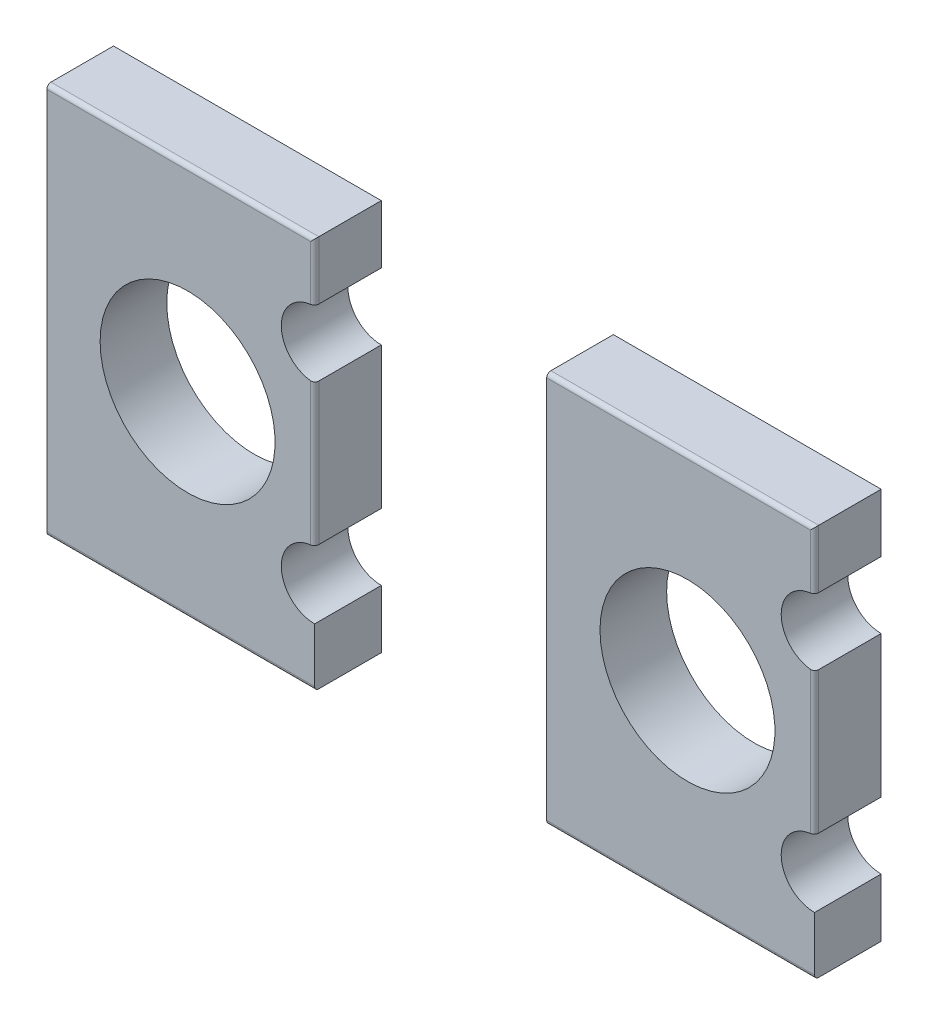
ISO-10303-21;
HEADER;
FILE_DESCRIPTION(('STEP AP214'),'2;1');
FILE_NAME('part.step','',(''),(''),'','','');
FILE_SCHEMA(('AUTOMOTIVE_DESIGN { 1 0 10303 214 1 1 1 1 }'));
ENDSEC;
DATA;
#1=APPLICATION_CONTEXT('core data for automotive mechanical design processes');
#2=APPLICATION_PROTOCOL_DEFINITION('international standard','automotive_design',2000,#1);
#3=PRODUCT_CONTEXT('',#1,'mechanical');
#4=PRODUCT('Part','Part','',(#3));
#5=PRODUCT_RELATED_PRODUCT_CATEGORY('part','',(#4));
#6=PRODUCT_DEFINITION_FORMATION('','',#4);
#7=PRODUCT_DEFINITION_CONTEXT('part definition',#1,'design');
#8=PRODUCT_DEFINITION('design','',#6,#7);
#9=PRODUCT_DEFINITION_SHAPE('','',#8);
#10=(LENGTH_UNIT() NAMED_UNIT(*) SI_UNIT(.MILLI.,.METRE.));
#11=(NAMED_UNIT(*) PLANE_ANGLE_UNIT() SI_UNIT($,.RADIAN.));
#12=(NAMED_UNIT(*) SI_UNIT($,.STERADIAN.) SOLID_ANGLE_UNIT());
#13=UNCERTAINTY_MEASURE_WITH_UNIT(LENGTH_MEASURE(1.E-05),#10,'distance_accuracy_value','');
#14=(GEOMETRIC_REPRESENTATION_CONTEXT(3) GLOBAL_UNCERTAINTY_ASSIGNED_CONTEXT((#13)) GLOBAL_UNIT_ASSIGNED_CONTEXT((#10,
#11,#12)) REPRESENTATION_CONTEXT('',''));
#15=CARTESIAN_POINT('',(0.,0.,0.));
#16=DIRECTION('',(0.,0.,1.));
#17=DIRECTION('',(1.,0.,0.));
#18=AXIS2_PLACEMENT_3D('',#15,#16,#17);
#19=CARTESIAN_POINT('',(78.,-23.5,-2.37395000000016));
#20=DIRECTION('',(1.,0.,0.));
#21=DIRECTION('',(0.,0.,1.));
#22=AXIS2_PLACEMENT_3D('',#19,#20,#21);
#23=PLANE('',#22);
#24=DIRECTION('',(0.,-1.,0.));
#25=VECTOR('',#24,1.);
#26=CARTESIAN_POINT('',(78.,-8.50000000000002,-2.87395000000006));
#27=LINE('',#26,#25);
#28=CARTESIAN_POINT('',(78.,23.5,-2.87394999999983));
#29=VERTEX_POINT('',#28);
#30=CARTESIAN_POINT('',(78.,16.5,-2.87394999999988));
#31=VERTEX_POINT('',#30);
#32=EDGE_CURVE('E191',#29,#31,#27,.T.);
#33=ORIENTED_EDGE('',*,*,#32,.T.);
#34=DIRECTION('',(0.,0.,1.));
#35=VECTOR('',#34,1.);
#36=CARTESIAN_POINT('',(78.,16.5,-10.3739499999999));
#37=LINE('',#36,#35);
#38=CARTESIAN_POINT('',(78.,16.5,-10.3739499999999));
#39=VERTEX_POINT('',#38);
#40=EDGE_CURVE('E62',#39,#31,#37,.T.);
#41=ORIENTED_EDGE('',*,*,#40,.F.);
#42=DIRECTION('',(0.,-1.,0.));
#43=VECTOR('',#42,1.);
#44=CARTESIAN_POINT('',(78.,-23.5,-10.3739500000002));
#45=LINE('',#44,#43);
#46=CARTESIAN_POINT('',(78.,23.5,-10.3739499999998));
#47=VERTEX_POINT('',#46);
#48=EDGE_CURVE('E148',#47,#39,#45,.T.);
#49=ORIENTED_EDGE('',*,*,#48,.F.);
#50=DIRECTION('',(0.,0.,-1.));
#51=VECTOR('',#50,1.);
#52=CARTESIAN_POINT('',(78.,23.5,-2.37394999999983));
#53=LINE('',#52,#51);
#54=EDGE_CURVE('E171',#29,#47,#53,.T.);
#55=ORIENTED_EDGE('',*,*,#54,.F.);
#56=EDGE_LOOP('',(#33,#41,#49,#55));
#57=FACE_BOUND('',#56,.T.);
#58=ADVANCED_FACE('F42',(#57),#23,.T.);
#59=CARTESIAN_POINT('',(78.,8.50000000000004,-10.3739499999999));
#60=VERTEX_POINT('',#59);
#61=CARTESIAN_POINT('',(78.,-8.49999999999996,-10.3739500000001));
#62=VERTEX_POINT('',#61);
#63=EDGE_CURVE('E144',#60,#62,#45,.T.);
#64=ORIENTED_EDGE('',*,*,#63,.F.);
#65=DIRECTION('',(0.,0.,1.));
#66=VECTOR('',#65,1.);
#67=CARTESIAN_POINT('',(78.,8.50000000000004,-10.3739499999999));
#68=LINE('',#67,#66);
#69=CARTESIAN_POINT('',(78.,8.49999999999999,-2.87394999999994));
#70=VERTEX_POINT('',#69);
#71=EDGE_CURVE('E132',#60,#70,#68,.T.);
#72=ORIENTED_EDGE('',*,*,#71,.T.);
#73=CARTESIAN_POINT('',(78.,-8.50000000000002,-2.87395000000006));
#74=VERTEX_POINT('',#73);
#75=EDGE_CURVE('E190',#70,#74,#27,.T.);
#76=ORIENTED_EDGE('',*,*,#75,.T.);
#77=DIRECTION('',(0.,0.,1.));
#78=VECTOR('',#77,1.);
#79=CARTESIAN_POINT('',(78.,-8.49999999999996,-10.3739500000001));
#80=LINE('',#79,#78);
#81=EDGE_CURVE('E154',#62,#74,#80,.T.);
#82=ORIENTED_EDGE('',*,*,#81,.F.);
#83=EDGE_LOOP('',(#64,#72,#76,#82));
#84=FACE_BOUND('',#83,.T.);
#85=ADVANCED_FACE('F152',(#84),#23,.T.);
#86=CARTESIAN_POINT('',(45.856,23.5,-2.37394999999983));
#87=DIRECTION('',(0.,0.,-1.));
#88=DIRECTION('',(1.,0.,0.));
#89=AXIS2_PLACEMENT_3D('',#86,#87,#88);
#90=PLANE('',#89);
#91=CARTESIAN_POINT('',(62.75,0.,-2.37395));
#92=DIRECTION('',(0.,0.,1.));
#93=DIRECTION('',(-1.,0.,0.));
#94=AXIS2_PLACEMENT_3D('',#91,#92,#93);
#95=CIRCLE('',#94,10.5);
#96=CARTESIAN_POINT('',(52.25,0.,-2.37395));
#97=VERTEX_POINT('',#96);
#98=EDGE_CURVE('E293',#97,#97,#95,.T.);
#99=ORIENTED_EDGE('',*,*,#98,.F.);
#100=EDGE_LOOP('',(#99));
#101=FACE_BOUND('',#100,.T.);
#102=CARTESIAN_POINT('',(78.,12.5,-2.37394999999991));
#103=DIRECTION('',(0.,0.,-1.));
#104=DIRECTION('',(-1.,0.,0.));
#105=AXIS2_PLACEMENT_3D('',#102,#103,#104);
#106=CIRCLE('',#105,4.);
#107=CARTESIAN_POINT('',(77.5,8.5313730334031,-2.37394999999994));
#108=VERTEX_POINT('',#107);
#109=CARTESIAN_POINT('',(77.5,16.4686269665969,-2.37394999999988));
#110=VERTEX_POINT('',#109);
#111=EDGE_CURVE('E149',#108,#110,#106,.T.);
#112=ORIENTED_EDGE('',*,*,#111,.T.);
#113=DIRECTION('',(0.,-1.,0.));
#114=VECTOR('',#113,1.);
#115=CARTESIAN_POINT('',(77.5,23.5,-2.37394999999983));
#116=LINE('',#115,#114);
#117=CARTESIAN_POINT('',(77.5,23.,-2.37394999999984));
#118=VERTEX_POINT('',#117);
#119=EDGE_CURVE('E180',#110,#118,#116,.F.);
#120=ORIENTED_EDGE('',*,*,#119,.T.);
#121=DIRECTION('',(1.,0.,0.));
#122=VECTOR('',#121,1.);
#123=CARTESIAN_POINT('',(45.856,23.,-2.37394999999984));
#124=LINE('',#123,#122);
#125=CARTESIAN_POINT('',(45.856,23.,-2.37394999999984));
#126=VERTEX_POINT('',#125);
#127=EDGE_CURVE('E184',#118,#126,#124,.F.);
#128=ORIENTED_EDGE('',*,*,#127,.T.);
#129=DIRECTION('',(0.,1.,0.));
#130=VECTOR('',#129,1.);
#131=CARTESIAN_POINT('',(45.856,-23.5,-2.37395000000016));
#132=LINE('',#131,#130);
#133=CARTESIAN_POINT('',(45.856,-23.,-2.37395000000016));
#134=VERTEX_POINT('',#133);
#135=EDGE_CURVE('E165',#134,#126,#132,.T.);
#136=ORIENTED_EDGE('',*,*,#135,.F.);
#137=DIRECTION('',(-1.,0.,0.));
#138=VECTOR('',#137,1.);
#139=CARTESIAN_POINT('',(78.,-23.,-2.37395000000016));
#140=LINE('',#139,#138);
#141=CARTESIAN_POINT('',(78.,-23.,-2.37395000000016));
#142=VERTEX_POINT('',#141);
#143=EDGE_CURVE('E178',#134,#142,#140,.F.);
#144=ORIENTED_EDGE('',*,*,#143,.T.);
#145=DIRECTION('',(0.,-1.,0.));
#146=VECTOR('',#145,1.);
#147=CARTESIAN_POINT('',(78.,-23.5,-2.37395000000016));
#148=LINE('',#147,#146);
#149=CARTESIAN_POINT('',(78.,-16.5,-2.37395000000011));
#150=VERTEX_POINT('',#149);
#151=EDGE_CURVE('E175',#150,#142,#148,.T.);
#152=ORIENTED_EDGE('',*,*,#151,.F.);
#153=CARTESIAN_POINT('',(78.,-12.5,-2.37395000000008));
#154=DIRECTION('',(0.,0.,1.));
#155=DIRECTION('',(-1.,0.,0.));
#156=AXIS2_PLACEMENT_3D('',#153,#154,#155);
#157=CIRCLE('',#156,4.);
#158=CARTESIAN_POINT('',(77.5,-8.53137303340313,-2.37395000000006));
#159=VERTEX_POINT('',#158);
#160=EDGE_CURVE('E261',#159,#150,#157,.T.);
#161=ORIENTED_EDGE('',*,*,#160,.F.);
#162=EDGE_CURVE('E181',#159,#108,#116,.F.);
#163=ORIENTED_EDGE('',*,*,#162,.T.);
#164=EDGE_LOOP('',(#112,#120,#128,#136,#144,#152,#161,#163));
#165=FACE_BOUND('',#164,.T.);
#166=ADVANCED_FACE('F218',(#101,#165),#90,.F.);
#167=CARTESIAN_POINT('',(45.856,23.5,-10.3739499999998));
#168=DIRECTION('',(0.,0.,-1.));
#169=DIRECTION('',(1.,0.,0.));
#170=AXIS2_PLACEMENT_3D('',#167,#168,#169);
#171=PLANE('',#170);
#172=CARTESIAN_POINT('',(62.75,0.,-10.37395));
#173=DIRECTION('',(0.,0.,1.));
#174=DIRECTION('',(-1.,0.,0.));
#175=AXIS2_PLACEMENT_3D('',#172,#173,#174);
#176=CIRCLE('',#175,10.5);
#177=CARTESIAN_POINT('',(52.25,0.,-10.37395));
#178=VERTEX_POINT('',#177);
#179=EDGE_CURVE('E279',#178,#178,#176,.T.);
#180=ORIENTED_EDGE('',*,*,#179,.T.);
#181=EDGE_LOOP('',(#180));
#182=FACE_BOUND('',#181,.T.);
#183=ORIENTED_EDGE('',*,*,#48,.T.);
#184=CARTESIAN_POINT('',(78.,12.5,-10.3739499999999));
#185=DIRECTION('',(0.,0.,-1.));
#186=DIRECTION('',(-1.,0.,0.));
#187=AXIS2_PLACEMENT_3D('',#184,#185,#186);
#188=CIRCLE('',#187,4.);
#189=EDGE_CURVE('E135',#60,#39,#188,.T.);
#190=ORIENTED_EDGE('',*,*,#189,.F.);
#191=ORIENTED_EDGE('',*,*,#63,.T.);
#192=CARTESIAN_POINT('',(78.,-12.5,-10.3739500000001));
#193=DIRECTION('',(0.,0.,1.));
#194=DIRECTION('',(-1.,0.,0.));
#195=AXIS2_PLACEMENT_3D('',#192,#193,#194);
#196=CIRCLE('',#195,4.);
#197=CARTESIAN_POINT('',(78.,-16.5,-10.3739500000001));
#198=VERTEX_POINT('',#197);
#199=EDGE_CURVE('E263',#62,#198,#196,.T.);
#200=ORIENTED_EDGE('',*,*,#199,.T.);
#201=CARTESIAN_POINT('',(78.,-23.5,-10.3739500000002));
#202=VERTEX_POINT('',#201);
#203=EDGE_CURVE('E155',#198,#202,#45,.T.);
#204=ORIENTED_EDGE('',*,*,#203,.T.);
#205=DIRECTION('',(-1.,0.,0.));
#206=VECTOR('',#205,1.);
#207=CARTESIAN_POINT('',(45.856,-23.5,-10.3739500000002));
#208=LINE('',#207,#206);
#209=CARTESIAN_POINT('',(45.856,-23.5,-10.3739500000002));
#210=VERTEX_POINT('',#209);
#211=EDGE_CURVE('E157',#202,#210,#208,.T.);
#212=ORIENTED_EDGE('',*,*,#211,.T.);
#213=DIRECTION('',(0.,1.,0.));
#214=VECTOR('',#213,1.);
#215=CARTESIAN_POINT('',(45.856,-23.5,-10.3739500000002));
#216=LINE('',#215,#214);
#217=CARTESIAN_POINT('',(45.856,23.5,-10.3739499999998));
#218=VERTEX_POINT('',#217);
#219=EDGE_CURVE('E278',#210,#218,#216,.T.);
#220=ORIENTED_EDGE('',*,*,#219,.T.);
#221=DIRECTION('',(1.,0.,0.));
#222=VECTOR('',#221,1.);
#223=CARTESIAN_POINT('',(45.856,23.5,-10.3739499999998));
#224=LINE('',#223,#222);
#225=EDGE_CURVE('E159',#218,#47,#224,.T.);
#226=ORIENTED_EDGE('',*,*,#225,.T.);
#227=EDGE_LOOP('',(#183,#190,#191,#200,#204,#212,#220,#226));
#228=FACE_BOUND('',#227,.T.);
#229=ADVANCED_FACE('F142',(#182,#228),#171,.T.);
#230=CARTESIAN_POINT('',(77.5,-23.5,-2.87395000000016));
#231=DIRECTION('',(0.,1.,0.));
#232=DIRECTION('',(0.,0.,1.));
#233=AXIS2_PLACEMENT_3D('',#230,#231,#232);
#234=CYLINDRICAL_SURFACE('',#233,0.5);
#235=ORIENTED_EDGE('',*,*,#75,.F.);
#236=CARTESIAN_POINT('',(78.,8.49999999999999,-2.87394999999994));
#237=CARTESIAN_POINT('',(78.0000238852926,8.50000844736236,-2.84582521756565));
#238=CARTESIAN_POINT('',(77.9976284168206,8.50000014137243,-2.81770752553701));
#239=CARTESIAN_POINT('',(77.9881748673677,8.50001245699837,-2.76228805177802));
#240=CARTESIAN_POINT('',(77.9811203171639,8.50003305672199,-2.73498566854843));
#241=CARTESIAN_POINT('',(77.9625196642059,8.50016547430944,-2.68194063548705));
#242=CARTESIAN_POINT('',(77.9509713668905,8.50027733677154,-2.65619875485057));
#243=CARTESIAN_POINT('',(77.923721664622,8.50070408728427,-2.60702392898067));
#244=CARTESIAN_POINT('',(77.9080209811445,8.50101894007906,-2.58359058360989));
#245=CARTESIAN_POINT('',(77.8729243728044,8.50198068078659,-2.53971006134666));
#246=CARTESIAN_POINT('',(77.8535309043002,8.50262734846531,-2.51926091531324));
#247=CARTESIAN_POINT('',(77.811597391798,8.5043844154786,-2.48190998407642));
#248=CARTESIAN_POINT('',(77.7890569391532,8.50549487507551,-2.46500866028465));
#249=CARTESIAN_POINT('',(77.7415512242527,8.50828754021241,-2.43527410270588));
#250=CARTESIAN_POINT('',(77.7165923122098,8.50996827594664,-2.422430573243));
#251=CARTESIAN_POINT('',(77.6649278832305,8.51397488277034,-2.40110892277394));
#252=CARTESIAN_POINT('',(77.6382232071983,8.51630044498261,-2.39262871723952));
#253=CARTESIAN_POINT('',(77.5928023270264,8.52073791090588,-2.38228082681515));
#254=CARTESIAN_POINT('',(77.5743444618312,8.52266893611079,-2.37915596094231));
#255=CARTESIAN_POINT('',(77.5372542496884,8.52681264427116,-2.37499068595531));
#256=CARTESIAN_POINT('',(77.5186222022104,8.52902490513208,-2.3739471913868));
#257=CARTESIAN_POINT('',(77.5,8.5313730334031,-2.37394999999994));
#258=B_SPLINE_CURVE_WITH_KNOTS('',3,(#236,#237,#238,#239,#240,#241,#242,#243,#244,#245,#246,
#247,#248,#249,#250,#251,#252,#253,#254,#255,#256,#257),.UNSPECIFIED.,.F.,.F.,(4,2,2,2,2,2,2,2,
2,2,4),(0.,0.0842623736269267,0.168460964127702,0.252700725462577,0.336925859772936,
0.421095163882221,0.505275407848148,0.589240316780146,0.673165075102063,0.729513611671212,
0.785778554103672),.UNSPECIFIED.);
#259=EDGE_CURVE('E12',#70,#108,#258,.T.);
#260=ORIENTED_EDGE('',*,*,#259,.T.);
#261=ORIENTED_EDGE('',*,*,#162,.F.);
#262=CARTESIAN_POINT('',(78.,-8.50000000000002,-2.87395000000006));
#263=CARTESIAN_POINT('',(78.0000238852926,-8.50000844736239,-2.84582521756577));
#264=CARTESIAN_POINT('',(77.9976284168206,-8.50000014137246,-2.81770752553713));
#265=CARTESIAN_POINT('',(77.9881748673677,-8.5000124569984,-2.76228805177814));
#266=CARTESIAN_POINT('',(77.9811203171639,-8.50003305672203,-2.73498566854855));
#267=CARTESIAN_POINT('',(77.9625196642059,-8.50016547430947,-2.68194063548717));
#268=CARTESIAN_POINT('',(77.9509713668905,-8.50027733677157,-2.65619875485069));
#269=CARTESIAN_POINT('',(77.923721664622,-8.50070408728431,-2.60702392898079));
#270=CARTESIAN_POINT('',(77.9080209811445,-8.5010189400791,-2.58359058361001));
#271=CARTESIAN_POINT('',(77.8729243728044,-8.50198068078662,-2.53971006134678));
#272=CARTESIAN_POINT('',(77.8535309043002,-8.50262734846534,-2.51926091531336));
#273=CARTESIAN_POINT('',(77.811597391798,-8.50438441547864,-2.48190998407654));
#274=CARTESIAN_POINT('',(77.7890569391532,-8.50549487507555,-2.46500866028477));
#275=CARTESIAN_POINT('',(77.7415512242527,-8.50828754021245,-2.435274102706));
#276=CARTESIAN_POINT('',(77.7165923122098,-8.50996827594667,-2.42243057324311));
#277=CARTESIAN_POINT('',(77.6649278832304,-8.51397488277038,-2.40110892277406));
#278=CARTESIAN_POINT('',(77.6382232071983,-8.51630044498265,-2.39262871723963));
#279=CARTESIAN_POINT('',(77.5928023270264,-8.52073791090592,-2.38228082681527));
#280=CARTESIAN_POINT('',(77.5743444618312,-8.52266893611083,-2.37915596094243));
#281=CARTESIAN_POINT('',(77.5372542496884,-8.5268126442712,-2.37499068595543));
#282=CARTESIAN_POINT('',(77.5186222022104,-8.52902490513212,-2.37394719138692));
#283=CARTESIAN_POINT('',(77.5,-8.53137303340313,-2.37395000000006));
#284=B_SPLINE_CURVE_WITH_KNOTS('',3,(#262,#263,#264,#265,#266,#267,#268,#269,#270,#271,#272,
#273,#274,#275,#276,#277,#278,#279,#280,#281,#282,#283),.UNSPECIFIED.,.F.,.F.,(4,2,2,2,2,2,2,2,
2,2,4),(0.,0.0842623736269267,0.168460964127702,0.252700725462577,0.336925859772936,
0.42109516388222,0.505275407848148,0.58924031678016,0.673165075102063,0.729513611671211,
0.785778554103672),.UNSPECIFIED.);
#285=EDGE_CURVE('E194',#74,#159,#284,.T.);
#286=ORIENTED_EDGE('',*,*,#285,.F.);
#287=EDGE_LOOP('',(#235,#260,#261,#286));
#288=FACE_BOUND('',#287,.T.);
#289=ADVANCED_FACE('F203',(#288),#234,.T.);
#290=ORIENTED_EDGE('',*,*,#119,.F.);
#291=CARTESIAN_POINT('',(77.5,16.4686269665969,-2.37394999999988));
#292=CARTESIAN_POINT('',(77.5278849773793,16.4721516242944,-2.37392471992964));
#293=CARTESIAN_POINT('',(77.5558073167433,16.4753597667055,-2.37628148351666));
#294=CARTESIAN_POINT('',(77.6109189502501,16.4811253191979,-2.38561529060331));
#295=CARTESIAN_POINT('',(77.6381087190411,16.4836831601524,-2.39258926375719));
#296=CARTESIAN_POINT('',(77.6910058177469,16.4881367516386,-2.41102072540113));
#297=CARTESIAN_POINT('',(77.7167120550183,16.4900320192425,-2.42248147130759));
#298=CARTESIAN_POINT('',(77.7658624093332,16.4932173706388,-2.44956358257072));
#299=CARTESIAN_POINT('',(77.7893071035935,16.4945076091798,-2.46518388243052));
#300=CARTESIAN_POINT('',(77.8331677640411,16.4965795991203,-2.50007632125132));
#301=CARTESIAN_POINT('',(77.8535957042828,16.4973634049177,-2.519333291212));
#302=CARTESIAN_POINT('',(77.8909554344362,16.4985571724629,-2.56100127991983));
#303=CARTESIAN_POINT('',(77.9078864327876,16.4989670496405,-2.58341301084576));
#304=CARTESIAN_POINT('',(77.9377936538893,16.499544397412,-2.63079682140046));
#305=CARTESIAN_POINT('',(77.950762147102,16.4997113965858,-2.65577377978969));
#306=CARTESIAN_POINT('',(77.9723278769205,16.4999188991173,-2.70754227809494));
#307=CARTESIAN_POINT('',(77.9809275059891,16.4999594717708,-2.73433281573551));
#308=CARTESIAN_POINT('',(77.9914680305794,16.4999931614861,-2.78005156097654));
#309=CARTESIAN_POINT('',(77.9946652673613,16.4999974277786,-2.79869998362941));
#310=CARTESIAN_POINT('',(77.9989312027301,16.5000000111937,-2.83621305344729));
#311=CARTESIAN_POINT('',(78.0000027781476,16.4999983363655,-2.8550773735739));
#312=CARTESIAN_POINT('',(78.,16.5,-2.87394999999988));
#313=B_SPLINE_CURVE_WITH_KNOTS('',3,(#291,#292,#293,#294,#295,#296,#297,#298,#299,#300,#301,
#302,#303,#304,#305,#306,#307,#308,#309,#310,#311,#312),.UNSPECIFIED.,.F.,.F.,(4,2,2,2,2,2,2,2,
2,2,4),(0.,0.0842164799292642,0.16837701387131,0.252598762373427,0.336798957643934,
0.420655405022979,0.504530813219172,0.58856880517644,0.672560726790195,0.729208813290971,
0.785780180875638),.UNSPECIFIED.);
#314=EDGE_CURVE('E55',#110,#31,#313,.T.);
#315=ORIENTED_EDGE('',*,*,#314,.T.);
#316=ORIENTED_EDGE('',*,*,#32,.F.);
#317=CARTESIAN_POINT('',(77.5,23.,-2.87394999999984));
#318=DIRECTION('',(-0.707106781186547,0.707106781186547,0.));
#319=DIRECTION('',(0.707106781186547,0.707106781186547,0.));
#320=AXIS2_PLACEMENT_3D('',#317,#318,#319);
#321=ELLIPSE('',#320,0.707106781186547,0.5);
#322=EDGE_CURVE('E256',#118,#29,#321,.T.);
#323=ORIENTED_EDGE('',*,*,#322,.F.);
#324=EDGE_LOOP('',(#290,#315,#316,#323));
#325=FACE_BOUND('',#324,.T.);
#326=ADVANCED_FACE('F237',(#325),#234,.T.);
#327=CARTESIAN_POINT('',(45.856,-23.5,-2.37395000000016));
#328=DIRECTION('',(-1.,0.,0.));
#329=DIRECTION('',(0.,0.,-1.));
#330=AXIS2_PLACEMENT_3D('',#327,#328,#329);
#331=PLANE('',#330);
#332=ORIENTED_EDGE('',*,*,#135,.T.);
#333=CARTESIAN_POINT('',(45.856,23.,-2.87394999999984));
#334=DIRECTION('',(-1.,0.,0.));
#335=DIRECTION('',(0.,0.,-1.));
#336=AXIS2_PLACEMENT_3D('',#333,#334,#335);
#337=CIRCLE('',#336,0.5);
#338=CARTESIAN_POINT('',(45.856,23.5,-2.87394999999983));
#339=VERTEX_POINT('',#338);
#340=EDGE_CURVE('E188',#126,#339,#337,.T.);
#341=ORIENTED_EDGE('',*,*,#340,.T.);
#342=DIRECTION('',(0.,0.,-1.));
#343=VECTOR('',#342,1.);
#344=CARTESIAN_POINT('',(45.856,23.5,-2.37394999999983));
#345=LINE('',#344,#343);
#346=EDGE_CURVE('E173',#339,#218,#345,.T.);
#347=ORIENTED_EDGE('',*,*,#346,.T.);
#348=ORIENTED_EDGE('',*,*,#219,.F.);
#349=DIRECTION('',(0.,0.,-1.));
#350=VECTOR('',#349,1.);
#351=CARTESIAN_POINT('',(45.856,-23.5,-2.37395000000016));
#352=LINE('',#351,#350);
#353=CARTESIAN_POINT('',(45.856,-23.5,-2.87395000000016));
#354=VERTEX_POINT('',#353);
#355=EDGE_CURVE('E166',#354,#210,#352,.T.);
#356=ORIENTED_EDGE('',*,*,#355,.F.);
#357=CARTESIAN_POINT('',(45.856,-23.,-2.87395000000016));
#358=DIRECTION('',(-1.,0.,0.));
#359=DIRECTION('',(0.,0.,-1.));
#360=AXIS2_PLACEMENT_3D('',#357,#358,#359);
#361=CIRCLE('',#360,0.5);
#362=EDGE_CURVE('E186',#354,#134,#361,.T.);
#363=ORIENTED_EDGE('',*,*,#362,.T.);
#364=EDGE_LOOP('',(#332,#341,#347,#348,#356,#363));
#365=FACE_BOUND('',#364,.T.);
#366=ADVANCED_FACE('F229',(#365),#331,.T.);
#367=CARTESIAN_POINT('',(45.856,-23.5,-2.37395000000016));
#368=DIRECTION('',(0.,-1.,0.));
#369=DIRECTION('',(0.,0.,-1.));
#370=AXIS2_PLACEMENT_3D('',#367,#368,#369);
#371=PLANE('',#370);
#372=DIRECTION('',(0.,0.,-1.));
#373=VECTOR('',#372,1.);
#374=CARTESIAN_POINT('',(78.,-23.5,-2.37395000000016));
#375=LINE('',#374,#373);
#376=CARTESIAN_POINT('',(78.,-23.5,-2.87395000000016));
#377=VERTEX_POINT('',#376);
#378=EDGE_CURVE('E169',#377,#202,#375,.T.);
#379=ORIENTED_EDGE('',*,*,#378,.F.);
#380=DIRECTION('',(-1.,0.,0.));
#381=VECTOR('',#380,1.);
#382=CARTESIAN_POINT('',(45.856,-23.5,-2.87395000000016));
#383=LINE('',#382,#381);
#384=EDGE_CURVE('E201',#377,#354,#383,.T.);
#385=ORIENTED_EDGE('',*,*,#384,.T.);
#386=ORIENTED_EDGE('',*,*,#355,.T.);
#387=ORIENTED_EDGE('',*,*,#211,.F.);
#388=EDGE_LOOP('',(#379,#385,#386,#387));
#389=FACE_BOUND('',#388,.T.);
#390=ADVANCED_FACE('F225',(#389),#371,.T.);
#391=ORIENTED_EDGE('',*,*,#151,.T.);
#392=CARTESIAN_POINT('',(78.,-23.,-2.87395000000016));
#393=DIRECTION('',(1.,0.,0.));
#394=DIRECTION('',(0.,0.,1.));
#395=AXIS2_PLACEMENT_3D('',#392,#393,#394);
#396=CIRCLE('',#395,0.5);
#397=EDGE_CURVE('E70',#142,#377,#396,.T.);
#398=ORIENTED_EDGE('',*,*,#397,.T.);
#399=ORIENTED_EDGE('',*,*,#378,.T.);
#400=ORIENTED_EDGE('',*,*,#203,.F.);
#401=DIRECTION('',(0.,0.,1.));
#402=VECTOR('',#401,1.);
#403=CARTESIAN_POINT('',(78.,-16.5,-10.3739500000001));
#404=LINE('',#403,#402);
#405=EDGE_CURVE('E282',#198,#150,#404,.T.);
#406=ORIENTED_EDGE('',*,*,#405,.T.);
#407=EDGE_LOOP('',(#391,#398,#399,#400,#406));
#408=FACE_BOUND('',#407,.T.);
#409=ADVANCED_FACE('F228',(#408),#23,.T.);
#410=CARTESIAN_POINT('',(45.856,23.5,-2.37394999999983));
#411=DIRECTION('',(0.,1.,0.));
#412=DIRECTION('',(0.,0.,1.));
#413=AXIS2_PLACEMENT_3D('',#410,#411,#412);
#414=PLANE('',#413);
#415=ORIENTED_EDGE('',*,*,#346,.F.);
#416=DIRECTION('',(1.,0.,0.));
#417=VECTOR('',#416,1.);
#418=CARTESIAN_POINT('',(78.,23.5,-2.87394999999983));
#419=LINE('',#418,#417);
#420=EDGE_CURVE('E168',#339,#29,#419,.T.);
#421=ORIENTED_EDGE('',*,*,#420,.T.);
#422=ORIENTED_EDGE('',*,*,#54,.T.);
#423=ORIENTED_EDGE('',*,*,#225,.F.);
#424=EDGE_LOOP('',(#415,#421,#422,#423));
#425=FACE_BOUND('',#424,.T.);
#426=ADVANCED_FACE('F216',(#425),#414,.T.);
#427=CARTESIAN_POINT('',(62.75,0.,-10.37395));
#428=DIRECTION('',(0.,0.,1.));
#429=DIRECTION('',(-1.,0.,0.));
#430=AXIS2_PLACEMENT_3D('',#427,#428,#429);
#431=CYLINDRICAL_SURFACE('',#430,10.5);
#432=ORIENTED_EDGE('',*,*,#179,.F.);
#433=EDGE_LOOP('',(#432));
#434=FACE_BOUND('',#433,.T.);
#435=ORIENTED_EDGE('',*,*,#98,.T.);
#436=EDGE_LOOP('',(#435));
#437=FACE_BOUND('',#436,.T.);
#438=ADVANCED_FACE('F211',(#434,#437),#431,.F.);
#439=CARTESIAN_POINT('',(78.,-12.5,-10.3739500000001));
#440=DIRECTION('',(0.,0.,1.));
#441=DIRECTION('',(-1.,0.,0.));
#442=AXIS2_PLACEMENT_3D('',#439,#440,#441);
#443=CYLINDRICAL_SURFACE('',#442,4.);
#444=ORIENTED_EDGE('',*,*,#81,.T.);
#445=ORIENTED_EDGE('',*,*,#285,.T.);
#446=ORIENTED_EDGE('',*,*,#160,.T.);
#447=ORIENTED_EDGE('',*,*,#405,.F.);
#448=ORIENTED_EDGE('',*,*,#199,.F.);
#449=EDGE_LOOP('',(#444,#445,#446,#447,#448));
#450=FACE_BOUND('',#449,.T.);
#451=ADVANCED_FACE('F206',(#450),#443,.F.);
#452=CARTESIAN_POINT('',(45.856,23.,-2.87394999999984));
#453=DIRECTION('',(-1.,0.,0.));
#454=DIRECTION('',(0.,0.,-1.));
#455=AXIS2_PLACEMENT_3D('',#452,#453,#454);
#456=CYLINDRICAL_SURFACE('',#455,0.5);
#457=ORIENTED_EDGE('',*,*,#340,.F.);
#458=ORIENTED_EDGE('',*,*,#127,.F.);
#459=ORIENTED_EDGE('',*,*,#322,.T.);
#460=ORIENTED_EDGE('',*,*,#420,.F.);
#461=EDGE_LOOP('',(#457,#458,#459,#460));
#462=FACE_BOUND('',#461,.T.);
#463=ADVANCED_FACE('F210',(#462),#456,.T.);
#464=CARTESIAN_POINT('',(45.856,-23.,-2.87395000000016));
#465=DIRECTION('',(1.,0.,0.));
#466=DIRECTION('',(0.,0.,1.));
#467=AXIS2_PLACEMENT_3D('',#464,#465,#466);
#468=CYLINDRICAL_SURFACE('',#467,0.5);
#469=ORIENTED_EDGE('',*,*,#397,.F.);
#470=ORIENTED_EDGE('',*,*,#143,.F.);
#471=ORIENTED_EDGE('',*,*,#362,.F.);
#472=ORIENTED_EDGE('',*,*,#384,.F.);
#473=EDGE_LOOP('',(#469,#470,#471,#472));
#474=FACE_BOUND('',#473,.T.);
#475=ADVANCED_FACE('F44',(#474),#468,.T.);
#476=CARTESIAN_POINT('',(78.,12.5,-10.3739499999999));
#477=DIRECTION('',(0.,0.,1.));
#478=DIRECTION('',(-1.,0.,0.));
#479=AXIS2_PLACEMENT_3D('',#476,#477,#478);
#480=CYLINDRICAL_SURFACE('',#479,4.);
#481=ORIENTED_EDGE('',*,*,#71,.F.);
#482=ORIENTED_EDGE('',*,*,#189,.T.);
#483=ORIENTED_EDGE('',*,*,#40,.T.);
#484=ORIENTED_EDGE('',*,*,#314,.F.);
#485=ORIENTED_EDGE('',*,*,#111,.F.);
#486=ORIENTED_EDGE('',*,*,#259,.F.);
#487=EDGE_LOOP('',(#481,#482,#483,#484,#485,#486));
#488=FACE_BOUND('',#487,.T.);
#489=ADVANCED_FACE('F134',(#488),#480,.F.);
#490=CLOSED_SHELL('',(#58,#85,#166,#229,#289,#326,#366,#390,#409,#426,#438,#451,#463,#475,#489));
#491=MANIFOLD_SOLID_BREP('B2',#490);
#492=CARTESIAN_POINT('',(18.,-23.5,-2.37395000000016));
#493=DIRECTION('',(1.,0.,0.));
#494=DIRECTION('',(0.,0.,1.));
#495=AXIS2_PLACEMENT_3D('',#492,#493,#494);
#496=PLANE('',#495);
#497=DIRECTION('',(0.,-1.,0.));
#498=VECTOR('',#497,1.);
#499=CARTESIAN_POINT('',(18.,-8.50000000000002,-2.87395000000006));
#500=LINE('',#499,#498);
#501=CARTESIAN_POINT('',(18.,23.5,-2.87394999999983));
#502=VERTEX_POINT('',#501);
#503=CARTESIAN_POINT('',(18.,16.5,-2.87394999999988));
#504=VERTEX_POINT('',#503);
#505=EDGE_CURVE('E548',#502,#504,#500,.T.);
#506=ORIENTED_EDGE('',*,*,#505,.T.);
#507=DIRECTION('',(0.,0.,1.));
#508=VECTOR('',#507,1.);
#509=CARTESIAN_POINT('',(18.,16.5,-10.3739499999999));
#510=LINE('',#509,#508);
#511=CARTESIAN_POINT('',(18.,16.5,-10.3739499999999));
#512=VERTEX_POINT('',#511);
#513=EDGE_CURVE('E419',#512,#504,#510,.T.);
#514=ORIENTED_EDGE('',*,*,#513,.F.);
#515=DIRECTION('',(0.,-1.,0.));
#516=VECTOR('',#515,1.);
#517=CARTESIAN_POINT('',(18.,-23.5,-10.3739500000002));
#518=LINE('',#517,#516);
#519=CARTESIAN_POINT('',(18.,23.5,-10.3739499999998));
#520=VERTEX_POINT('',#519);
#521=EDGE_CURVE('E505',#520,#512,#518,.T.);
#522=ORIENTED_EDGE('',*,*,#521,.F.);
#523=DIRECTION('',(0.,0.,-1.));
#524=VECTOR('',#523,1.);
#525=CARTESIAN_POINT('',(18.,23.5,-2.37394999999983));
#526=LINE('',#525,#524);
#527=EDGE_CURVE('E528',#502,#520,#526,.T.);
#528=ORIENTED_EDGE('',*,*,#527,.F.);
#529=EDGE_LOOP('',(#506,#514,#522,#528));
#530=FACE_BOUND('',#529,.T.);
#531=ADVANCED_FACE('F399',(#530),#496,.T.);
#532=CARTESIAN_POINT('',(18.,8.50000000000004,-10.3739499999999));
#533=VERTEX_POINT('',#532);
#534=CARTESIAN_POINT('',(18.,-8.49999999999996,-10.3739500000001));
#535=VERTEX_POINT('',#534);
#536=EDGE_CURVE('E501',#533,#535,#518,.T.);
#537=ORIENTED_EDGE('',*,*,#536,.F.);
#538=DIRECTION('',(0.,0.,1.));
#539=VECTOR('',#538,1.);
#540=CARTESIAN_POINT('',(18.,8.50000000000004,-10.3739499999999));
#541=LINE('',#540,#539);
#542=CARTESIAN_POINT('',(18.,8.49999999999999,-2.87394999999994));
#543=VERTEX_POINT('',#542);
#544=EDGE_CURVE('E489',#533,#543,#541,.T.);
#545=ORIENTED_EDGE('',*,*,#544,.T.);
#546=CARTESIAN_POINT('',(18.,-8.50000000000002,-2.87395000000006));
#547=VERTEX_POINT('',#546);
#548=EDGE_CURVE('E547',#543,#547,#500,.T.);
#549=ORIENTED_EDGE('',*,*,#548,.T.);
#550=DIRECTION('',(0.,0.,1.));
#551=VECTOR('',#550,1.);
#552=CARTESIAN_POINT('',(18.,-8.49999999999996,-10.3739500000001));
#553=LINE('',#552,#551);
#554=EDGE_CURVE('E511',#535,#547,#553,.T.);
#555=ORIENTED_EDGE('',*,*,#554,.F.);
#556=EDGE_LOOP('',(#537,#545,#549,#555));
#557=FACE_BOUND('',#556,.T.);
#558=ADVANCED_FACE('F509',(#557),#496,.T.);
#559=CARTESIAN_POINT('',(-14.144,23.5,-2.37394999999983));
#560=DIRECTION('',(0.,0.,-1.));
#561=DIRECTION('',(1.,0.,0.));
#562=AXIS2_PLACEMENT_3D('',#559,#560,#561);
#563=PLANE('',#562);
#564=CARTESIAN_POINT('',(2.75,0.,-2.37395));
#565=DIRECTION('',(0.,0.,1.));
#566=DIRECTION('',(-1.,0.,0.));
#567=AXIS2_PLACEMENT_3D('',#564,#565,#566);
#568=CIRCLE('',#567,10.5);
#569=CARTESIAN_POINT('',(-7.75,0.,-2.37395));
#570=VERTEX_POINT('',#569);
#571=EDGE_CURVE('E650',#570,#570,#568,.T.);
#572=ORIENTED_EDGE('',*,*,#571,.F.);
#573=EDGE_LOOP('',(#572));
#574=FACE_BOUND('',#573,.T.);
#575=CARTESIAN_POINT('',(18.,12.5,-2.37394999999991));
#576=DIRECTION('',(0.,0.,-1.));
#577=DIRECTION('',(-1.,0.,0.));
#578=AXIS2_PLACEMENT_3D('',#575,#576,#577);
#579=CIRCLE('',#578,4.);
#580=CARTESIAN_POINT('',(17.5,8.5313730334031,-2.37394999999994));
#581=VERTEX_POINT('',#580);
#582=CARTESIAN_POINT('',(17.5,16.4686269665969,-2.37394999999988));
#583=VERTEX_POINT('',#582);
#584=EDGE_CURVE('E506',#581,#583,#579,.T.);
#585=ORIENTED_EDGE('',*,*,#584,.T.);
#586=DIRECTION('',(0.,-1.,0.));
#587=VECTOR('',#586,1.);
#588=CARTESIAN_POINT('',(17.5,23.5,-2.37394999999983));
#589=LINE('',#588,#587);
#590=CARTESIAN_POINT('',(17.5,23.,-2.37394999999984));
#591=VERTEX_POINT('',#590);
#592=EDGE_CURVE('E537',#583,#591,#589,.F.);
#593=ORIENTED_EDGE('',*,*,#592,.T.);
#594=DIRECTION('',(1.,0.,0.));
#595=VECTOR('',#594,1.);
#596=CARTESIAN_POINT('',(-14.144,23.,-2.37394999999984));
#597=LINE('',#596,#595);
#598=CARTESIAN_POINT('',(-14.144,23.,-2.37394999999984));
#599=VERTEX_POINT('',#598);
#600=EDGE_CURVE('E541',#591,#599,#597,.F.);
#601=ORIENTED_EDGE('',*,*,#600,.T.);
#602=DIRECTION('',(0.,1.,0.));
#603=VECTOR('',#602,1.);
#604=CARTESIAN_POINT('',(-14.144,-23.5,-2.37395000000016));
#605=LINE('',#604,#603);
#606=CARTESIAN_POINT('',(-14.144,-23.,-2.37395000000016));
#607=VERTEX_POINT('',#606);
#608=EDGE_CURVE('E522',#607,#599,#605,.T.);
#609=ORIENTED_EDGE('',*,*,#608,.F.);
#610=DIRECTION('',(-1.,0.,0.));
#611=VECTOR('',#610,1.);
#612=CARTESIAN_POINT('',(18.,-23.,-2.37395000000016));
#613=LINE('',#612,#611);
#614=CARTESIAN_POINT('',(18.,-23.,-2.37395000000016));
#615=VERTEX_POINT('',#614);
#616=EDGE_CURVE('E535',#607,#615,#613,.F.);
#617=ORIENTED_EDGE('',*,*,#616,.T.);
#618=DIRECTION('',(0.,-1.,0.));
#619=VECTOR('',#618,1.);
#620=CARTESIAN_POINT('',(18.,-23.5,-2.37395000000016));
#621=LINE('',#620,#619);
#622=CARTESIAN_POINT('',(18.,-16.5,-2.37395000000011));
#623=VERTEX_POINT('',#622);
#624=EDGE_CURVE('E532',#623,#615,#621,.T.);
#625=ORIENTED_EDGE('',*,*,#624,.F.);
#626=CARTESIAN_POINT('',(18.,-12.5,-2.37395000000008));
#627=DIRECTION('',(0.,0.,1.));
#628=DIRECTION('',(-1.,0.,0.));
#629=AXIS2_PLACEMENT_3D('',#626,#627,#628);
#630=CIRCLE('',#629,4.);
#631=CARTESIAN_POINT('',(17.5,-8.53137303340313,-2.37395000000006));
#632=VERTEX_POINT('',#631);
#633=EDGE_CURVE('E618',#632,#623,#630,.T.);
#634=ORIENTED_EDGE('',*,*,#633,.F.);
#635=EDGE_CURVE('E538',#632,#581,#589,.F.);
#636=ORIENTED_EDGE('',*,*,#635,.T.);
#637=EDGE_LOOP('',(#585,#593,#601,#609,#617,#625,#634,#636));
#638=FACE_BOUND('',#637,.T.);
#639=ADVANCED_FACE('F575',(#574,#638),#563,.F.);
#640=CARTESIAN_POINT('',(-14.144,23.5,-10.3739499999998));
#641=DIRECTION('',(0.,0.,-1.));
#642=DIRECTION('',(1.,0.,0.));
#643=AXIS2_PLACEMENT_3D('',#640,#641,#642);
#644=PLANE('',#643);
#645=CARTESIAN_POINT('',(2.75,0.,-10.37395));
#646=DIRECTION('',(0.,0.,1.));
#647=DIRECTION('',(-1.,0.,0.));
#648=AXIS2_PLACEMENT_3D('',#645,#646,#647);
#649=CIRCLE('',#648,10.5);
#650=CARTESIAN_POINT('',(-7.75,0.,-10.37395));
#651=VERTEX_POINT('',#650);
#652=EDGE_CURVE('E636',#651,#651,#649,.T.);
#653=ORIENTED_EDGE('',*,*,#652,.T.);
#654=EDGE_LOOP('',(#653));
#655=FACE_BOUND('',#654,.T.);
#656=ORIENTED_EDGE('',*,*,#521,.T.);
#657=CARTESIAN_POINT('',(18.,12.5,-10.3739499999999));
#658=DIRECTION('',(0.,0.,-1.));
#659=DIRECTION('',(-1.,0.,0.));
#660=AXIS2_PLACEMENT_3D('',#657,#658,#659);
#661=CIRCLE('',#660,4.);
#662=EDGE_CURVE('E492',#533,#512,#661,.T.);
#663=ORIENTED_EDGE('',*,*,#662,.F.);
#664=ORIENTED_EDGE('',*,*,#536,.T.);
#665=CARTESIAN_POINT('',(18.,-12.5,-10.3739500000001));
#666=DIRECTION('',(0.,0.,1.));
#667=DIRECTION('',(-1.,0.,0.));
#668=AXIS2_PLACEMENT_3D('',#665,#666,#667);
#669=CIRCLE('',#668,4.);
#670=CARTESIAN_POINT('',(18.,-16.5,-10.3739500000001));
#671=VERTEX_POINT('',#670);
#672=EDGE_CURVE('E620',#535,#671,#669,.T.);
#673=ORIENTED_EDGE('',*,*,#672,.T.);
#674=CARTESIAN_POINT('',(18.,-23.5,-10.3739500000002));
#675=VERTEX_POINT('',#674);
#676=EDGE_CURVE('E512',#671,#675,#518,.T.);
#677=ORIENTED_EDGE('',*,*,#676,.T.);
#678=DIRECTION('',(-1.,0.,0.));
#679=VECTOR('',#678,1.);
#680=CARTESIAN_POINT('',(-14.144,-23.5,-10.3739500000002));
#681=LINE('',#680,#679);
#682=CARTESIAN_POINT('',(-14.144,-23.5,-10.3739500000002));
#683=VERTEX_POINT('',#682);
#684=EDGE_CURVE('E514',#675,#683,#681,.T.);
#685=ORIENTED_EDGE('',*,*,#684,.T.);
#686=DIRECTION('',(0.,1.,0.));
#687=VECTOR('',#686,1.);
#688=CARTESIAN_POINT('',(-14.144,-23.5,-10.3739500000002));
#689=LINE('',#688,#687);
#690=CARTESIAN_POINT('',(-14.144,23.5,-10.3739499999998));
#691=VERTEX_POINT('',#690);
#692=EDGE_CURVE('E635',#683,#691,#689,.T.);
#693=ORIENTED_EDGE('',*,*,#692,.T.);
#694=DIRECTION('',(1.,0.,0.));
#695=VECTOR('',#694,1.);
#696=CARTESIAN_POINT('',(-14.144,23.5,-10.3739499999998));
#697=LINE('',#696,#695);
#698=EDGE_CURVE('E516',#691,#520,#697,.T.);
#699=ORIENTED_EDGE('',*,*,#698,.T.);
#700=EDGE_LOOP('',(#656,#663,#664,#673,#677,#685,#693,#699));
#701=FACE_BOUND('',#700,.T.);
#702=ADVANCED_FACE('F499',(#655,#701),#644,.T.);
#703=CARTESIAN_POINT('',(17.5,-23.5,-2.87395000000016));
#704=DIRECTION('',(0.,1.,0.));
#705=DIRECTION('',(0.,0.,1.));
#706=AXIS2_PLACEMENT_3D('',#703,#704,#705);
#707=CYLINDRICAL_SURFACE('',#706,0.5);
#708=ORIENTED_EDGE('',*,*,#548,.F.);
#709=CARTESIAN_POINT('',(18.,8.49999999999999,-2.87394999999994));
#710=CARTESIAN_POINT('',(18.0000238852926,8.50000844736236,-2.84582521756565));
#711=CARTESIAN_POINT('',(17.9976284168206,8.50000014137243,-2.81770752553701));
#712=CARTESIAN_POINT('',(17.9881748673677,8.50001245699837,-2.76228805177802));
#713=CARTESIAN_POINT('',(17.9811203171639,8.50003305672199,-2.73498566854843));
#714=CARTESIAN_POINT('',(17.9625196642059,8.50016547430944,-2.68194063548705));
#715=CARTESIAN_POINT('',(17.9509713668905,8.50027733677154,-2.65619875485057));
#716=CARTESIAN_POINT('',(17.923721664622,8.50070408728427,-2.60702392898067));
#717=CARTESIAN_POINT('',(17.9080209811445,8.50101894007906,-2.58359058360989));
#718=CARTESIAN_POINT('',(17.8729243728044,8.50198068078659,-2.53971006134666));
#719=CARTESIAN_POINT('',(17.8535309043002,8.50262734846531,-2.51926091531324));
#720=CARTESIAN_POINT('',(17.811597391798,8.5043844154786,-2.48190998407642));
#721=CARTESIAN_POINT('',(17.7890569391532,8.50549487507551,-2.46500866028465));
#722=CARTESIAN_POINT('',(17.7415512242527,8.50828754021241,-2.43527410270588));
#723=CARTESIAN_POINT('',(17.7165923122098,8.50996827594664,-2.422430573243));
#724=CARTESIAN_POINT('',(17.6649278832305,8.51397488277034,-2.40110892277394));
#725=CARTESIAN_POINT('',(17.6382232071983,8.51630044498261,-2.39262871723952));
#726=CARTESIAN_POINT('',(17.5928023270264,8.52073791090588,-2.38228082681515));
#727=CARTESIAN_POINT('',(17.5743444618312,8.52266893611079,-2.37915596094231));
#728=CARTESIAN_POINT('',(17.5372542496884,8.52681264427116,-2.37499068595531));
#729=CARTESIAN_POINT('',(17.5186222022104,8.52902490513208,-2.3739471913868));
#730=CARTESIAN_POINT('',(17.5,8.5313730334031,-2.37394999999994));
#731=B_SPLINE_CURVE_WITH_KNOTS('',3,(#709,#710,#711,#712,#713,#714,#715,#716,#717,#718,#719,
#720,#721,#722,#723,#724,#725,#726,#727,#728,#729,#730),.UNSPECIFIED.,.F.,.F.,(4,2,2,2,2,2,2,2,
2,2,4),(0.,0.0842623736269284,0.168460964127701,0.252700725462579,0.33692585977294,
0.421095163882218,0.505275407848147,0.589240316780149,0.673165075102059,0.729513611671215,
0.785778554103672),.UNSPECIFIED.);
#732=EDGE_CURVE('E40',#543,#581,#731,.T.);
#733=ORIENTED_EDGE('',*,*,#732,.T.);
#734=ORIENTED_EDGE('',*,*,#635,.F.);
#735=CARTESIAN_POINT('',(18.,-8.50000000000002,-2.87395000000006));
#736=CARTESIAN_POINT('',(18.0000238852926,-8.50000844736239,-2.84582521756577));
#737=CARTESIAN_POINT('',(17.9976284168206,-8.50000014137246,-2.81770752553712));
#738=CARTESIAN_POINT('',(17.9881748673677,-8.5000124569984,-2.76228805177814));
#739=CARTESIAN_POINT('',(17.9811203171639,-8.50003305672203,-2.73498566854855));
#740=CARTESIAN_POINT('',(17.9625196642059,-8.50016547430947,-2.68194063548717));
#741=CARTESIAN_POINT('',(17.9509713668905,-8.50027733677157,-2.65619875485069));
#742=CARTESIAN_POINT('',(17.923721664622,-8.50070408728431,-2.60702392898079));
#743=CARTESIAN_POINT('',(17.9080209811445,-8.50101894007909,-2.58359058361001));
#744=CARTESIAN_POINT('',(17.8729243728044,-8.50198068078662,-2.53971006134678));
#745=CARTESIAN_POINT('',(17.8535309043002,-8.50262734846535,-2.51926091531336));
#746=CARTESIAN_POINT('',(17.811597391798,-8.50438441547865,-2.48190998407654));
#747=CARTESIAN_POINT('',(17.7890569391532,-8.50549487507555,-2.46500866028477));
#748=CARTESIAN_POINT('',(17.7415512242527,-8.50828754021245,-2.435274102706));
#749=CARTESIAN_POINT('',(17.7165923122098,-8.50996827594667,-2.42243057324312));
#750=CARTESIAN_POINT('',(17.6649278832305,-8.51397488277038,-2.40110892277406));
#751=CARTESIAN_POINT('',(17.6382232071983,-8.51630044498265,-2.39262871723963));
#752=CARTESIAN_POINT('',(17.5928023270264,-8.52073791090592,-2.38228082681527));
#753=CARTESIAN_POINT('',(17.5743444618312,-8.52266893611083,-2.37915596094243));
#754=CARTESIAN_POINT('',(17.5372542496884,-8.5268126442712,-2.37499068595543));
#755=CARTESIAN_POINT('',(17.5186222022104,-8.52902490513212,-2.37394719138691));
#756=CARTESIAN_POINT('',(17.5,-8.53137303340313,-2.37395000000006));
#757=B_SPLINE_CURVE_WITH_KNOTS('',3,(#735,#736,#737,#738,#739,#740,#741,#742,#743,#744,#745,
#746,#747,#748,#749,#750,#751,#752,#753,#754,#755,#756),.UNSPECIFIED.,.F.,.F.,(4,2,2,2,2,2,2,2,
2,2,4),(0.,0.0842623736269284,0.168460964127701,0.252700725462579,0.33692585977294,
0.421095163882217,0.505275407848147,0.589240316780149,0.673165075102059,0.729513611671214,
0.785778554103671),.UNSPECIFIED.);
#758=EDGE_CURVE('E551',#547,#632,#757,.T.);
#759=ORIENTED_EDGE('',*,*,#758,.F.);
#760=EDGE_LOOP('',(#708,#733,#734,#759));
#761=FACE_BOUND('',#760,.T.);
#762=ADVANCED_FACE('F560',(#761),#707,.T.);
#763=ORIENTED_EDGE('',*,*,#592,.F.);
#764=CARTESIAN_POINT('',(17.5,16.4686269665969,-2.37394999999988));
#765=CARTESIAN_POINT('',(17.5278849773793,16.4721516242944,-2.37392471992964));
#766=CARTESIAN_POINT('',(17.5558073167433,16.4753597667055,-2.37628148351666));
#767=CARTESIAN_POINT('',(17.6109189502501,16.4811253191979,-2.38561529060331));
#768=CARTESIAN_POINT('',(17.6381087190411,16.4836831601524,-2.3925892637572));
#769=CARTESIAN_POINT('',(17.6910058177469,16.4881367516386,-2.41102072540113));
#770=CARTESIAN_POINT('',(17.7167120550183,16.4900320192425,-2.42248147130759));
#771=CARTESIAN_POINT('',(17.7658624093332,16.4932173706388,-2.44956358257072));
#772=CARTESIAN_POINT('',(17.7893071035935,16.4945076091798,-2.46518388243052));
#773=CARTESIAN_POINT('',(17.8331677640411,16.4965795991203,-2.50007632125131));
#774=CARTESIAN_POINT('',(17.8535957042827,16.4973634049177,-2.51933329121199));
#775=CARTESIAN_POINT('',(17.8909554344362,16.4985571724629,-2.56100127991982));
#776=CARTESIAN_POINT('',(17.9078864327876,16.4989670496405,-2.58341301084576));
#777=CARTESIAN_POINT('',(17.9377936538893,16.499544397412,-2.63079682140046));
#778=CARTESIAN_POINT('',(17.950762147102,16.4997113965858,-2.65577377978969));
#779=CARTESIAN_POINT('',(17.9723278769205,16.4999188991173,-2.70754227809494));
#780=CARTESIAN_POINT('',(17.9809275059891,16.4999594717708,-2.73433281573551));
#781=CARTESIAN_POINT('',(17.9914680305794,16.4999931614861,-2.78005156097654));
#782=CARTESIAN_POINT('',(17.9946652673613,16.4999974277786,-2.79869998362941));
#783=CARTESIAN_POINT('',(17.9989312027301,16.5000000111937,-2.83621305344729));
#784=CARTESIAN_POINT('',(18.0000027781476,16.4999983363655,-2.8550773735739));
#785=CARTESIAN_POINT('',(18.,16.5,-2.87394999999988));
#786=B_SPLINE_CURVE_WITH_KNOTS('',3,(#764,#765,#766,#767,#768,#769,#770,#771,#772,#773,#774,
#775,#776,#777,#778,#779,#780,#781,#782,#783,#784,#785),.UNSPECIFIED.,.F.,.F.,(4,2,2,2,2,2,2,2,
2,2,4),(0.,0.084216479929275,0.16837701387131,0.252598762373424,0.336798957643925,
0.420655405022962,0.504530813219166,0.58856880517644,0.672560726790192,0.72920881329097,
0.785780180875636),.UNSPECIFIED.);
#787=EDGE_CURVE('E412',#583,#504,#786,.T.);
#788=ORIENTED_EDGE('',*,*,#787,.T.);
#789=ORIENTED_EDGE('',*,*,#505,.F.);
#790=CARTESIAN_POINT('',(17.5,23.,-2.87394999999984));
#791=DIRECTION('',(-0.707106781186547,0.707106781186547,0.));
#792=DIRECTION('',(0.707106781186547,0.707106781186547,0.));
#793=AXIS2_PLACEMENT_3D('',#790,#791,#792);
#794=ELLIPSE('',#793,0.707106781186547,0.5);
#795=EDGE_CURVE('E613',#591,#502,#794,.T.);
#796=ORIENTED_EDGE('',*,*,#795,.F.);
#797=EDGE_LOOP('',(#763,#788,#789,#796));
#798=FACE_BOUND('',#797,.T.);
#799=ADVANCED_FACE('F594',(#798),#707,.T.);
#800=CARTESIAN_POINT('',(-14.144,-23.5,-2.37395000000016));
#801=DIRECTION('',(-1.,0.,0.));
#802=DIRECTION('',(0.,0.,-1.));
#803=AXIS2_PLACEMENT_3D('',#800,#801,#802);
#804=PLANE('',#803);
#805=ORIENTED_EDGE('',*,*,#608,.T.);
#806=CARTESIAN_POINT('',(-14.144,23.,-2.87394999999984));
#807=DIRECTION('',(-1.,0.,0.));
#808=DIRECTION('',(0.,0.,-1.));
#809=AXIS2_PLACEMENT_3D('',#806,#807,#808);
#810=CIRCLE('',#809,0.5);
#811=CARTESIAN_POINT('',(-14.144,23.5,-2.87394999999983));
#812=VERTEX_POINT('',#811);
#813=EDGE_CURVE('E545',#599,#812,#810,.T.);
#814=ORIENTED_EDGE('',*,*,#813,.T.);
#815=DIRECTION('',(0.,0.,-1.));
#816=VECTOR('',#815,1.);
#817=CARTESIAN_POINT('',(-14.144,23.5,-2.37394999999983));
#818=LINE('',#817,#816);
#819=EDGE_CURVE('E530',#812,#691,#818,.T.);
#820=ORIENTED_EDGE('',*,*,#819,.T.);
#821=ORIENTED_EDGE('',*,*,#692,.F.);
#822=DIRECTION('',(0.,0.,-1.));
#823=VECTOR('',#822,1.);
#824=CARTESIAN_POINT('',(-14.144,-23.5,-2.37395000000016));
#825=LINE('',#824,#823);
#826=CARTESIAN_POINT('',(-14.144,-23.5,-2.87395000000016));
#827=VERTEX_POINT('',#826);
#828=EDGE_CURVE('E523',#827,#683,#825,.T.);
#829=ORIENTED_EDGE('',*,*,#828,.F.);
#830=CARTESIAN_POINT('',(-14.144,-23.,-2.87395000000016));
#831=DIRECTION('',(-1.,0.,0.));
#832=DIRECTION('',(0.,0.,-1.));
#833=AXIS2_PLACEMENT_3D('',#830,#831,#832);
#834=CIRCLE('',#833,0.5);
#835=EDGE_CURVE('E543',#827,#607,#834,.T.);
#836=ORIENTED_EDGE('',*,*,#835,.T.);
#837=EDGE_LOOP('',(#805,#814,#820,#821,#829,#836));
#838=FACE_BOUND('',#837,.T.);
#839=ADVANCED_FACE('F586',(#838),#804,.T.);
#840=CARTESIAN_POINT('',(-14.144,-23.5,-2.37395000000016));
#841=DIRECTION('',(0.,-1.,0.));
#842=DIRECTION('',(0.,0.,-1.));
#843=AXIS2_PLACEMENT_3D('',#840,#841,#842);
#844=PLANE('',#843);
#845=DIRECTION('',(0.,0.,-1.));
#846=VECTOR('',#845,1.);
#847=CARTESIAN_POINT('',(18.,-23.5,-2.37395000000016));
#848=LINE('',#847,#846);
#849=CARTESIAN_POINT('',(18.,-23.5,-2.87395000000016));
#850=VERTEX_POINT('',#849);
#851=EDGE_CURVE('E526',#850,#675,#848,.T.);
#852=ORIENTED_EDGE('',*,*,#851,.F.);
#853=DIRECTION('',(-1.,0.,0.));
#854=VECTOR('',#853,1.);
#855=CARTESIAN_POINT('',(-14.144,-23.5,-2.87395000000016));
#856=LINE('',#855,#854);
#857=EDGE_CURVE('E558',#850,#827,#856,.T.);
#858=ORIENTED_EDGE('',*,*,#857,.T.);
#859=ORIENTED_EDGE('',*,*,#828,.T.);
#860=ORIENTED_EDGE('',*,*,#684,.F.);
#861=EDGE_LOOP('',(#852,#858,#859,#860));
#862=FACE_BOUND('',#861,.T.);
#863=ADVANCED_FACE('F582',(#862),#844,.T.);
#864=ORIENTED_EDGE('',*,*,#624,.T.);
#865=CARTESIAN_POINT('',(18.,-23.,-2.87395000000016));
#866=DIRECTION('',(1.,0.,0.));
#867=DIRECTION('',(0.,0.,1.));
#868=AXIS2_PLACEMENT_3D('',#865,#866,#867);
#869=CIRCLE('',#868,0.5);
#870=EDGE_CURVE('E427',#615,#850,#869,.T.);
#871=ORIENTED_EDGE('',*,*,#870,.T.);
#872=ORIENTED_EDGE('',*,*,#851,.T.);
#873=ORIENTED_EDGE('',*,*,#676,.F.);
#874=DIRECTION('',(0.,0.,1.));
#875=VECTOR('',#874,1.);
#876=CARTESIAN_POINT('',(18.,-16.5,-10.3739500000001));
#877=LINE('',#876,#875);
#878=EDGE_CURVE('E639',#671,#623,#877,.T.);
#879=ORIENTED_EDGE('',*,*,#878,.T.);
#880=EDGE_LOOP('',(#864,#871,#872,#873,#879));
#881=FACE_BOUND('',#880,.T.);
#882=ADVANCED_FACE('F585',(#881),#496,.T.);
#883=CARTESIAN_POINT('',(-14.144,23.5,-2.37394999999983));
#884=DIRECTION('',(0.,1.,0.));
#885=DIRECTION('',(0.,0.,1.));
#886=AXIS2_PLACEMENT_3D('',#883,#884,#885);
#887=PLANE('',#886);
#888=ORIENTED_EDGE('',*,*,#819,.F.);
#889=DIRECTION('',(1.,0.,0.));
#890=VECTOR('',#889,1.);
#891=CARTESIAN_POINT('',(18.,23.5,-2.87394999999983));
#892=LINE('',#891,#890);
#893=EDGE_CURVE('E525',#812,#502,#892,.T.);
#894=ORIENTED_EDGE('',*,*,#893,.T.);
#895=ORIENTED_EDGE('',*,*,#527,.T.);
#896=ORIENTED_EDGE('',*,*,#698,.F.);
#897=EDGE_LOOP('',(#888,#894,#895,#896));
#898=FACE_BOUND('',#897,.T.);
#899=ADVANCED_FACE('F573',(#898),#887,.T.);
#900=CARTESIAN_POINT('',(2.75,0.,-10.37395));
#901=DIRECTION('',(0.,0.,1.));
#902=DIRECTION('',(-1.,0.,0.));
#903=AXIS2_PLACEMENT_3D('',#900,#901,#902);
#904=CYLINDRICAL_SURFACE('',#903,10.5);
#905=ORIENTED_EDGE('',*,*,#652,.F.);
#906=EDGE_LOOP('',(#905));
#907=FACE_BOUND('',#906,.T.);
#908=ORIENTED_EDGE('',*,*,#571,.T.);
#909=EDGE_LOOP('',(#908));
#910=FACE_BOUND('',#909,.T.);
#911=ADVANCED_FACE('F568',(#907,#910),#904,.F.);
#912=CARTESIAN_POINT('',(18.,-12.5,-10.3739500000001));
#913=DIRECTION('',(0.,0.,1.));
#914=DIRECTION('',(-1.,0.,0.));
#915=AXIS2_PLACEMENT_3D('',#912,#913,#914);
#916=CYLINDRICAL_SURFACE('',#915,4.);
#917=ORIENTED_EDGE('',*,*,#554,.T.);
#918=ORIENTED_EDGE('',*,*,#758,.T.);
#919=ORIENTED_EDGE('',*,*,#633,.T.);
#920=ORIENTED_EDGE('',*,*,#878,.F.);
#921=ORIENTED_EDGE('',*,*,#672,.F.);
#922=EDGE_LOOP('',(#917,#918,#919,#920,#921));
#923=FACE_BOUND('',#922,.T.);
#924=ADVANCED_FACE('F563',(#923),#916,.F.);
#925=CARTESIAN_POINT('',(-14.144,23.,-2.87394999999984));
#926=DIRECTION('',(-1.,0.,0.));
#927=DIRECTION('',(0.,0.,-1.));
#928=AXIS2_PLACEMENT_3D('',#925,#926,#927);
#929=CYLINDRICAL_SURFACE('',#928,0.5);
#930=ORIENTED_EDGE('',*,*,#813,.F.);
#931=ORIENTED_EDGE('',*,*,#600,.F.);
#932=ORIENTED_EDGE('',*,*,#795,.T.);
#933=ORIENTED_EDGE('',*,*,#893,.F.);
#934=EDGE_LOOP('',(#930,#931,#932,#933));
#935=FACE_BOUND('',#934,.T.);
#936=ADVANCED_FACE('F567',(#935),#929,.T.);
#937=CARTESIAN_POINT('',(-14.144,-23.,-2.87395000000016));
#938=DIRECTION('',(1.,0.,0.));
#939=DIRECTION('',(0.,0.,1.));
#940=AXIS2_PLACEMENT_3D('',#937,#938,#939);
#941=CYLINDRICAL_SURFACE('',#940,0.5);
#942=ORIENTED_EDGE('',*,*,#870,.F.);
#943=ORIENTED_EDGE('',*,*,#616,.F.);
#944=ORIENTED_EDGE('',*,*,#835,.F.);
#945=ORIENTED_EDGE('',*,*,#857,.F.);
#946=EDGE_LOOP('',(#942,#943,#944,#945));
#947=FACE_BOUND('',#946,.T.);
#948=ADVANCED_FACE('F401',(#947),#941,.T.);
#949=CARTESIAN_POINT('',(18.,12.5,-10.3739499999999));
#950=DIRECTION('',(0.,0.,1.));
#951=DIRECTION('',(-1.,0.,0.));
#952=AXIS2_PLACEMENT_3D('',#949,#950,#951);
#953=CYLINDRICAL_SURFACE('',#952,4.);
#954=ORIENTED_EDGE('',*,*,#544,.F.);
#955=ORIENTED_EDGE('',*,*,#662,.T.);
#956=ORIENTED_EDGE('',*,*,#513,.T.);
#957=ORIENTED_EDGE('',*,*,#787,.F.);
#958=ORIENTED_EDGE('',*,*,#584,.F.);
#959=ORIENTED_EDGE('',*,*,#732,.F.);
#960=EDGE_LOOP('',(#954,#955,#956,#957,#958,#959));
#961=FACE_BOUND('',#960,.T.);
#962=ADVANCED_FACE('F491',(#961),#953,.F.);
#963=CLOSED_SHELL('',(#531,#558,#639,#702,#762,#799,#839,#863,#882,#899,#911,#924,#936,#948,#962));
#964=MANIFOLD_SOLID_BREP('B6',#963);
#965=ADVANCED_BREP_SHAPE_REPRESENTATION('',(#18,#491,#964),#14);
#966=SHAPE_DEFINITION_REPRESENTATION(#9,#965);
ENDSEC;
END-ISO-10303-21;
